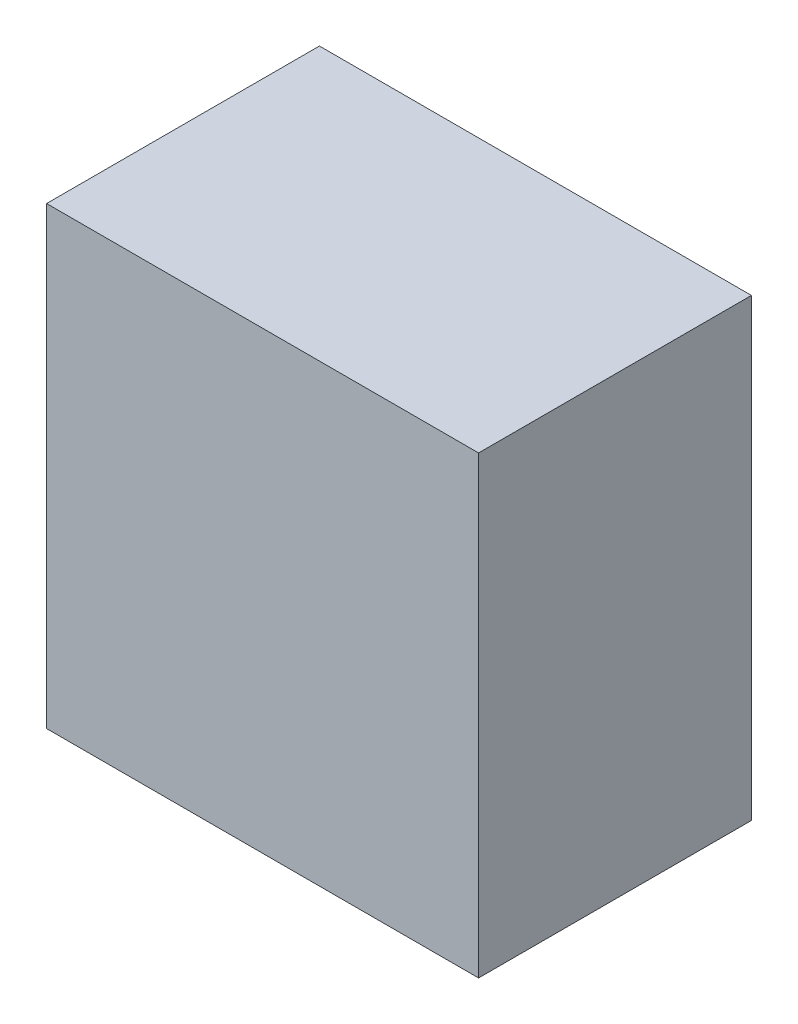
ISO-10303-21;
HEADER;
FILE_DESCRIPTION(('STEP AP214'),'2;1');
FILE_NAME('part.step','',(''),(''),'','','');
FILE_SCHEMA(('AUTOMOTIVE_DESIGN { 1 0 10303 214 1 1 1 1 }'));
ENDSEC;
DATA;
#1=APPLICATION_CONTEXT('core data for automotive mechanical design processes');
#2=APPLICATION_PROTOCOL_DEFINITION('international standard','automotive_design',2000,#1);
#3=PRODUCT_CONTEXT('',#1,'mechanical');
#4=PRODUCT('Part','Part','',(#3));
#5=PRODUCT_RELATED_PRODUCT_CATEGORY('part','',(#4));
#6=PRODUCT_DEFINITION_FORMATION('','',#4);
#7=PRODUCT_DEFINITION_CONTEXT('part definition',#1,'design');
#8=PRODUCT_DEFINITION('design','',#6,#7);
#9=PRODUCT_DEFINITION_SHAPE('','',#8);
#10=(LENGTH_UNIT() NAMED_UNIT(*) SI_UNIT(.MILLI.,.METRE.));
#11=(NAMED_UNIT(*) PLANE_ANGLE_UNIT() SI_UNIT($,.RADIAN.));
#12=(NAMED_UNIT(*) SI_UNIT($,.STERADIAN.) SOLID_ANGLE_UNIT());
#13=UNCERTAINTY_MEASURE_WITH_UNIT(LENGTH_MEASURE(1.E-05),#10,'distance_accuracy_value','');
#14=(GEOMETRIC_REPRESENTATION_CONTEXT(3) GLOBAL_UNCERTAINTY_ASSIGNED_CONTEXT((#13)) GLOBAL_UNIT_ASSIGNED_CONTEXT((#10,
#11,#12)) REPRESENTATION_CONTEXT('',''));
#15=CARTESIAN_POINT('',(0.,0.,0.));
#16=DIRECTION('',(0.,0.,1.));
#17=DIRECTION('',(1.,0.,0.));
#18=AXIS2_PLACEMENT_3D('',#15,#16,#17);
#19=CARTESIAN_POINT('',(0.,762.,0.));
#20=DIRECTION('',(1.,0.,0.));
#21=DIRECTION('',(0.,0.,-1.));
#22=AXIS2_PLACEMENT_3D('',#19,#20,#21);
#23=PLANE('',#22);
#24=DIRECTION('',(0.,0.,1.));
#25=VECTOR('',#24,1.);
#26=CARTESIAN_POINT('',(0.,0.,0.));
#27=LINE('',#26,#25);
#28=CARTESIAN_POINT('',(0.,0.,-457.2));
#29=VERTEX_POINT('',#28);
#30=CARTESIAN_POINT('',(0.,0.,0.));
#31=VERTEX_POINT('',#30);
#32=EDGE_CURVE('E94',#29,#31,#27,.T.);
#33=ORIENTED_EDGE('',*,*,#32,.T.);
#34=DIRECTION('',(0.,-1.,0.));
#35=VECTOR('',#34,1.);
#36=CARTESIAN_POINT('',(0.,762.,0.));
#37=LINE('',#36,#35);
#38=CARTESIAN_POINT('',(0.,762.,0.));
#39=VERTEX_POINT('',#38);
#40=EDGE_CURVE('E11',#39,#31,#37,.T.);
#41=ORIENTED_EDGE('',*,*,#40,.F.);
#42=DIRECTION('',(0.,0.,1.));
#43=VECTOR('',#42,1.);
#44=CARTESIAN_POINT('',(0.,762.,0.));
#45=LINE('',#44,#43);
#46=CARTESIAN_POINT('',(0.,762.,-457.2));
#47=VERTEX_POINT('',#46);
#48=EDGE_CURVE('E82',#47,#39,#45,.T.);
#49=ORIENTED_EDGE('',*,*,#48,.F.);
#50=DIRECTION('',(0.,-1.,0.));
#51=VECTOR('',#50,1.);
#52=CARTESIAN_POINT('',(0.,762.,-457.2));
#53=LINE('',#52,#51);
#54=EDGE_CURVE('E90',#47,#29,#53,.T.);
#55=ORIENTED_EDGE('',*,*,#54,.T.);
#56=EDGE_LOOP('',(#33,#41,#49,#55));
#57=FACE_BOUND('',#56,.T.);
#58=ADVANCED_FACE('F31',(#57),#23,.F.);
#59=CARTESIAN_POINT('',(0.,762.,0.));
#60=DIRECTION('',(0.,0.,-1.));
#61=DIRECTION('',(-1.,0.,0.));
#62=AXIS2_PLACEMENT_3D('',#59,#60,#61);
#63=PLANE('',#62);
#64=DIRECTION('',(1.,0.,0.));
#65=VECTOR('',#64,1.);
#66=CARTESIAN_POINT('',(0.,0.,0.));
#67=LINE('',#66,#65);
#68=CARTESIAN_POINT('',(723.9,0.,0.));
#69=VERTEX_POINT('',#68);
#70=EDGE_CURVE('E86',#31,#69,#67,.T.);
#71=ORIENTED_EDGE('',*,*,#70,.T.);
#72=DIRECTION('',(0.,-1.,0.));
#73=VECTOR('',#72,1.);
#74=CARTESIAN_POINT('',(723.9,762.,0.));
#75=LINE('',#74,#73);
#76=CARTESIAN_POINT('',(723.9,762.,0.));
#77=VERTEX_POINT('',#76);
#78=EDGE_CURVE('E39',#77,#69,#75,.T.);
#79=ORIENTED_EDGE('',*,*,#78,.F.);
#80=DIRECTION('',(1.,0.,0.));
#81=VECTOR('',#80,1.);
#82=CARTESIAN_POINT('',(0.,762.,0.));
#83=LINE('',#82,#81);
#84=EDGE_CURVE('E77',#39,#77,#83,.T.);
#85=ORIENTED_EDGE('',*,*,#84,.F.);
#86=ORIENTED_EDGE('',*,*,#40,.T.);
#87=EDGE_LOOP('',(#71,#79,#85,#86));
#88=FACE_BOUND('',#87,.T.);
#89=ADVANCED_FACE('F85',(#88),#63,.F.);
#90=CARTESIAN_POINT('',(723.9,762.,0.));
#91=DIRECTION('',(-1.,0.,0.));
#92=DIRECTION('',(0.,0.,1.));
#93=AXIS2_PLACEMENT_3D('',#90,#91,#92);
#94=PLANE('',#93);
#95=DIRECTION('',(0.,0.,-1.));
#96=VECTOR('',#95,1.);
#97=CARTESIAN_POINT('',(723.9,0.,0.));
#98=LINE('',#97,#96);
#99=CARTESIAN_POINT('',(723.9,0.,-457.2));
#100=VERTEX_POINT('',#99);
#101=EDGE_CURVE('E64',#69,#100,#98,.T.);
#102=ORIENTED_EDGE('',*,*,#101,.T.);
#103=DIRECTION('',(0.,-1.,0.));
#104=VECTOR('',#103,1.);
#105=CARTESIAN_POINT('',(723.9,762.,-457.2));
#106=LINE('',#105,#104);
#107=CARTESIAN_POINT('',(723.9,762.,-457.2));
#108=VERTEX_POINT('',#107);
#109=EDGE_CURVE('E87',#108,#100,#106,.T.);
#110=ORIENTED_EDGE('',*,*,#109,.F.);
#111=DIRECTION('',(0.,0.,-1.));
#112=VECTOR('',#111,1.);
#113=CARTESIAN_POINT('',(723.9,762.,0.));
#114=LINE('',#113,#112);
#115=EDGE_CURVE('E80',#77,#108,#114,.T.);
#116=ORIENTED_EDGE('',*,*,#115,.F.);
#117=ORIENTED_EDGE('',*,*,#78,.T.);
#118=EDGE_LOOP('',(#102,#110,#116,#117));
#119=FACE_BOUND('',#118,.T.);
#120=ADVANCED_FACE('F88',(#119),#94,.F.);
#121=CARTESIAN_POINT('',(0.,762.,-457.2));
#122=DIRECTION('',(0.,0.,1.));
#123=DIRECTION('',(1.,0.,0.));
#124=AXIS2_PLACEMENT_3D('',#121,#122,#123);
#125=PLANE('',#124);
#126=DIRECTION('',(-1.,0.,0.));
#127=VECTOR('',#126,1.);
#128=CARTESIAN_POINT('',(0.,0.,-457.2));
#129=LINE('',#128,#127);
#130=EDGE_CURVE('E70',#100,#29,#129,.T.);
#131=ORIENTED_EDGE('',*,*,#130,.T.);
#132=ORIENTED_EDGE('',*,*,#54,.F.);
#133=DIRECTION('',(-1.,0.,0.));
#134=VECTOR('',#133,1.);
#135=CARTESIAN_POINT('',(0.,762.,-457.2));
#136=LINE('',#135,#134);
#137=EDGE_CURVE('E47',#108,#47,#136,.T.);
#138=ORIENTED_EDGE('',*,*,#137,.F.);
#139=ORIENTED_EDGE('',*,*,#109,.T.);
#140=EDGE_LOOP('',(#131,#132,#138,#139));
#141=FACE_BOUND('',#140,.T.);
#142=ADVANCED_FACE('F101',(#141),#125,.F.);
#143=CARTESIAN_POINT('',(0.,762.,-457.2));
#144=DIRECTION('',(0.,-1.,0.));
#145=DIRECTION('',(0.,0.,-1.));
#146=AXIS2_PLACEMENT_3D('',#143,#144,#145);
#147=PLANE('',#146);
#148=ORIENTED_EDGE('',*,*,#48,.T.);
#149=ORIENTED_EDGE('',*,*,#84,.T.);
#150=ORIENTED_EDGE('',*,*,#115,.T.);
#151=ORIENTED_EDGE('',*,*,#137,.T.);
#152=EDGE_LOOP('',(#148,#149,#150,#151));
#153=FACE_BOUND('',#152,.T.);
#154=ADVANCED_FACE('F78',(#153),#147,.F.);
#155=CARTESIAN_POINT('',(0.,0.,-457.2));
#156=DIRECTION('',(0.,-1.,0.));
#157=DIRECTION('',(0.,0.,-1.));
#158=AXIS2_PLACEMENT_3D('',#155,#156,#157);
#159=PLANE('',#158);
#160=ORIENTED_EDGE('',*,*,#32,.F.);
#161=ORIENTED_EDGE('',*,*,#130,.F.);
#162=ORIENTED_EDGE('',*,*,#101,.F.);
#163=ORIENTED_EDGE('',*,*,#70,.F.);
#164=EDGE_LOOP('',(#160,#161,#162,#163));
#165=FACE_BOUND('',#164,.T.);
#166=ADVANCED_FACE('F104',(#165),#159,.T.);
#167=CLOSED_SHELL('',(#58,#89,#120,#142,#154,#166));
#168=MANIFOLD_SOLID_BREP('B2',#167);
#169=ADVANCED_BREP_SHAPE_REPRESENTATION('',(#18,#168),#14);
#170=SHAPE_DEFINITION_REPRESENTATION(#9,#169);
ENDSEC;
END-ISO-10303-21;
